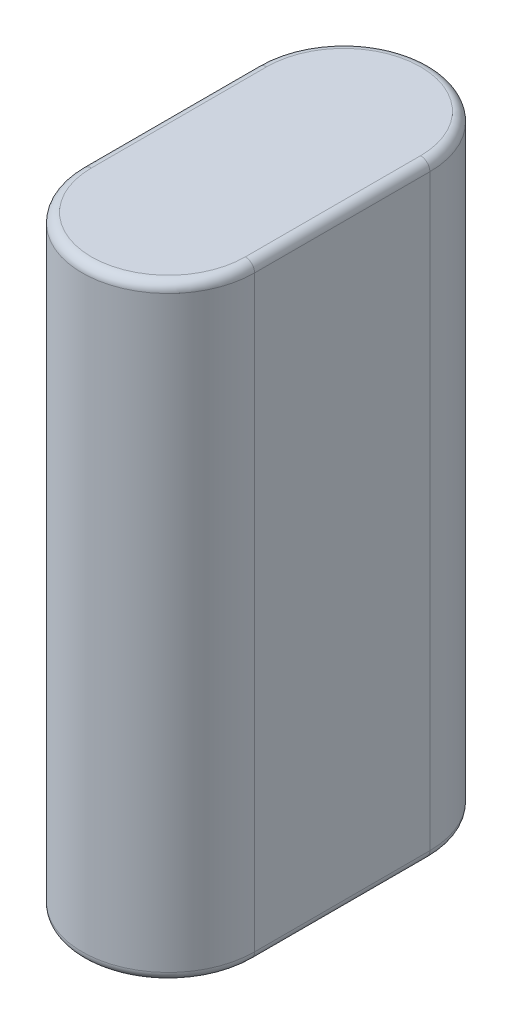
ISO-10303-21;
HEADER;
FILE_DESCRIPTION(('STEP AP214'),'2;1');
FILE_NAME('part.step','',(''),(''),'','','');
FILE_SCHEMA(('AUTOMOTIVE_DESIGN { 1 0 10303 214 1 1 1 1 }'));
ENDSEC;
DATA;
#1=APPLICATION_CONTEXT('core data for automotive mechanical design processes');
#2=APPLICATION_PROTOCOL_DEFINITION('international standard','automotive_design',2000,#1);
#3=PRODUCT_CONTEXT('',#1,'mechanical');
#4=PRODUCT('Part','Part','',(#3));
#5=PRODUCT_RELATED_PRODUCT_CATEGORY('part','',(#4));
#6=PRODUCT_DEFINITION_FORMATION('','',#4);
#7=PRODUCT_DEFINITION_CONTEXT('part definition',#1,'design');
#8=PRODUCT_DEFINITION('design','',#6,#7);
#9=PRODUCT_DEFINITION_SHAPE('','',#8);
#10=(LENGTH_UNIT() NAMED_UNIT(*) SI_UNIT(.MILLI.,.METRE.));
#11=(NAMED_UNIT(*) PLANE_ANGLE_UNIT() SI_UNIT($,.RADIAN.));
#12=(NAMED_UNIT(*) SI_UNIT($,.STERADIAN.) SOLID_ANGLE_UNIT());
#13=UNCERTAINTY_MEASURE_WITH_UNIT(LENGTH_MEASURE(1.E-05),#10,'distance_accuracy_value','');
#14=(GEOMETRIC_REPRESENTATION_CONTEXT(3) GLOBAL_UNCERTAINTY_ASSIGNED_CONTEXT((#13)) GLOBAL_UNIT_ASSIGNED_CONTEXT((#10,
#11,#12)) REPRESENTATION_CONTEXT('',''));
#15=CARTESIAN_POINT('',(0.,0.,0.));
#16=DIRECTION('',(0.,0.,1.));
#17=DIRECTION('',(1.,0.,0.));
#18=AXIS2_PLACEMENT_3D('',#15,#16,#17);
#19=CARTESIAN_POINT('',(0.,65.4,-9.45));
#20=DIRECTION('',(0.,-1.,0.));
#21=DIRECTION('',(0.,0.,-1.));
#22=AXIS2_PLACEMENT_3D('',#19,#20,#21);
#23=CYLINDRICAL_SURFACE('',#22,9.3);
#24=DIRECTION('',(0.,-1.,0.));
#25=VECTOR('',#24,1.);
#26=CARTESIAN_POINT('',(9.3,65.4,-9.45));
#27=LINE('',#26,#25);
#28=CARTESIAN_POINT('',(9.3,64.4,-9.45));
#29=VERTEX_POINT('',#28);
#30=CARTESIAN_POINT('',(9.3,1.,-9.45));
#31=VERTEX_POINT('',#30);
#32=EDGE_CURVE('E115',#29,#31,#27,.T.);
#33=ORIENTED_EDGE('',*,*,#32,.T.);
#34=CARTESIAN_POINT('',(0.,1.,-9.45));
#35=DIRECTION('',(0.,1.,0.));
#36=DIRECTION('',(0.,0.,1.));
#37=AXIS2_PLACEMENT_3D('',#34,#35,#36);
#38=CIRCLE('',#37,9.3);
#39=CARTESIAN_POINT('',(-9.3,1.,-9.45));
#40=VERTEX_POINT('',#39);
#41=EDGE_CURVE('E216',#31,#40,#38,.T.);
#42=ORIENTED_EDGE('',*,*,#41,.T.);
#43=DIRECTION('',(0.,-1.,0.));
#44=VECTOR('',#43,1.);
#45=CARTESIAN_POINT('',(-9.3,65.4,-9.45));
#46=LINE('',#45,#44);
#47=CARTESIAN_POINT('',(-9.3,64.4,-9.45));
#48=VERTEX_POINT('',#47);
#49=EDGE_CURVE('E144',#48,#40,#46,.T.);
#50=ORIENTED_EDGE('',*,*,#49,.F.);
#51=CARTESIAN_POINT('',(0.,64.4,-9.45));
#52=DIRECTION('',(0.,1.,0.));
#53=DIRECTION('',(0.,0.,1.));
#54=AXIS2_PLACEMENT_3D('',#51,#52,#53);
#55=CIRCLE('',#54,9.3);
#56=EDGE_CURVE('E213',#48,#29,#55,.F.);
#57=ORIENTED_EDGE('',*,*,#56,.T.);
#58=EDGE_LOOP('',(#33,#42,#50,#57));
#59=FACE_BOUND('',#58,.T.);
#60=ADVANCED_FACE('F43',(#59),#23,.T.);
#61=CARTESIAN_POINT('',(-9.3,65.4,-9.45));
#62=DIRECTION('',(1.,0.,0.));
#63=DIRECTION('',(0.,0.,-1.));
#64=AXIS2_PLACEMENT_3D('',#61,#62,#63);
#65=PLANE('',#64);
#66=ORIENTED_EDGE('',*,*,#49,.T.);
#67=DIRECTION('',(0.,0.,1.));
#68=VECTOR('',#67,1.);
#69=CARTESIAN_POINT('',(-9.3,1.,-9.45));
#70=LINE('',#69,#68);
#71=CARTESIAN_POINT('',(-9.3,1.,9.45));
#72=VERTEX_POINT('',#71);
#73=EDGE_CURVE('E210',#40,#72,#70,.T.);
#74=ORIENTED_EDGE('',*,*,#73,.T.);
#75=DIRECTION('',(0.,-1.,0.));
#76=VECTOR('',#75,1.);
#77=CARTESIAN_POINT('',(-9.3,65.4,9.45));
#78=LINE('',#77,#76);
#79=CARTESIAN_POINT('',(-9.3,64.4,9.45));
#80=VERTEX_POINT('',#79);
#81=EDGE_CURVE('E134',#80,#72,#78,.T.);
#82=ORIENTED_EDGE('',*,*,#81,.F.);
#83=DIRECTION('',(0.,0.,1.));
#84=VECTOR('',#83,1.);
#85=CARTESIAN_POINT('',(-9.3,64.4,-9.45));
#86=LINE('',#85,#84);
#87=EDGE_CURVE('E207',#80,#48,#86,.F.);
#88=ORIENTED_EDGE('',*,*,#87,.T.);
#89=EDGE_LOOP('',(#66,#74,#82,#88));
#90=FACE_BOUND('',#89,.T.);
#91=ADVANCED_FACE('F232',(#90),#65,.F.);
#92=CARTESIAN_POINT('',(0.,65.4,9.45));
#93=DIRECTION('',(0.,-1.,0.));
#94=DIRECTION('',(0.,0.,-1.));
#95=AXIS2_PLACEMENT_3D('',#92,#93,#94);
#96=CYLINDRICAL_SURFACE('',#95,9.3);
#97=ORIENTED_EDGE('',*,*,#81,.T.);
#98=CARTESIAN_POINT('',(0.,1.,9.45));
#99=DIRECTION('',(0.,1.,0.));
#100=DIRECTION('',(0.,0.,1.));
#101=AXIS2_PLACEMENT_3D('',#98,#99,#100);
#102=CIRCLE('',#101,9.3);
#103=CARTESIAN_POINT('',(9.3,1.,9.45));
#104=VERTEX_POINT('',#103);
#105=EDGE_CURVE('E132',#72,#104,#102,.T.);
#106=ORIENTED_EDGE('',*,*,#105,.T.);
#107=DIRECTION('',(0.,-1.,0.));
#108=VECTOR('',#107,1.);
#109=CARTESIAN_POINT('',(9.3,65.4,9.45));
#110=LINE('',#109,#108);
#111=CARTESIAN_POINT('',(9.3,64.4,9.45));
#112=VERTEX_POINT('',#111);
#113=EDGE_CURVE('E113',#112,#104,#110,.T.);
#114=ORIENTED_EDGE('',*,*,#113,.F.);
#115=CARTESIAN_POINT('',(0.,64.4,9.45));
#116=DIRECTION('',(0.,1.,0.));
#117=DIRECTION('',(0.,0.,1.));
#118=AXIS2_PLACEMENT_3D('',#115,#116,#117);
#119=CIRCLE('',#118,9.3);
#120=EDGE_CURVE('E129',#112,#80,#119,.F.);
#121=ORIENTED_EDGE('',*,*,#120,.T.);
#122=EDGE_LOOP('',(#97,#106,#114,#121));
#123=FACE_BOUND('',#122,.T.);
#124=ADVANCED_FACE('F128',(#123),#96,.T.);
#125=CARTESIAN_POINT('',(9.3,65.4,-9.45));
#126=DIRECTION('',(-1.,0.,0.));
#127=DIRECTION('',(0.,0.,1.));
#128=AXIS2_PLACEMENT_3D('',#125,#126,#127);
#129=PLANE('',#128);
#130=ORIENTED_EDGE('',*,*,#113,.T.);
#131=DIRECTION('',(0.,0.,-1.));
#132=VECTOR('',#131,1.);
#133=CARTESIAN_POINT('',(9.3,1.,-9.45));
#134=LINE('',#133,#132);
#135=EDGE_CURVE('E11',#104,#31,#134,.T.);
#136=ORIENTED_EDGE('',*,*,#135,.T.);
#137=ORIENTED_EDGE('',*,*,#32,.F.);
#138=DIRECTION('',(0.,0.,-1.));
#139=VECTOR('',#138,1.);
#140=CARTESIAN_POINT('',(9.3,64.4,9.45));
#141=LINE('',#140,#139);
#142=EDGE_CURVE('E53',#29,#112,#141,.F.);
#143=ORIENTED_EDGE('',*,*,#142,.T.);
#144=EDGE_LOOP('',(#130,#136,#137,#143));
#145=FACE_BOUND('',#144,.T.);
#146=ADVANCED_FACE('F112',(#145),#129,.F.);
#147=CARTESIAN_POINT('',(0.,65.4,-9.45));
#148=DIRECTION('',(0.,1.,0.));
#149=DIRECTION('',(0.,0.,1.));
#150=AXIS2_PLACEMENT_3D('',#147,#148,#149);
#151=PLANE('',#150);
#152=DIRECTION('',(0.,0.,1.));
#153=VECTOR('',#152,1.);
#154=CARTESIAN_POINT('',(-8.3,65.4,9.45));
#155=LINE('',#154,#153);
#156=CARTESIAN_POINT('',(-8.3,65.4,-9.45));
#157=VERTEX_POINT('',#156);
#158=CARTESIAN_POINT('',(-8.3,65.4,9.45));
#159=VERTEX_POINT('',#158);
#160=EDGE_CURVE('E61',#157,#159,#155,.T.);
#161=ORIENTED_EDGE('',*,*,#160,.T.);
#162=CARTESIAN_POINT('',(0.,65.4,9.45));
#163=DIRECTION('',(0.,1.,0.));
#164=DIRECTION('',(0.,0.,1.));
#165=AXIS2_PLACEMENT_3D('',#162,#163,#164);
#166=CIRCLE('',#165,8.3);
#167=CARTESIAN_POINT('',(8.30000000000001,65.4,9.45));
#168=VERTEX_POINT('',#167);
#169=EDGE_CURVE('E121',#159,#168,#166,.T.);
#170=ORIENTED_EDGE('',*,*,#169,.T.);
#171=DIRECTION('',(0.,0.,-1.));
#172=VECTOR('',#171,1.);
#173=CARTESIAN_POINT('',(8.30000000000001,65.4,-9.45));
#174=LINE('',#173,#172);
#175=CARTESIAN_POINT('',(8.30000000000001,65.4,-9.45));
#176=VERTEX_POINT('',#175);
#177=EDGE_CURVE('E147',#168,#176,#174,.T.);
#178=ORIENTED_EDGE('',*,*,#177,.T.);
#179=CARTESIAN_POINT('',(0.,65.4,-9.45));
#180=DIRECTION('',(0.,1.,0.));
#181=DIRECTION('',(0.,0.,1.));
#182=AXIS2_PLACEMENT_3D('',#179,#180,#181);
#183=CIRCLE('',#182,8.3);
#184=EDGE_CURVE('E66',#176,#157,#183,.T.);
#185=ORIENTED_EDGE('',*,*,#184,.T.);
#186=EDGE_LOOP('',(#161,#170,#178,#185));
#187=FACE_BOUND('',#186,.T.);
#188=ADVANCED_FACE('F226',(#187),#151,.T.);
#189=CARTESIAN_POINT('',(0.,0.,-9.45));
#190=DIRECTION('',(0.,1.,0.));
#191=DIRECTION('',(0.,0.,1.));
#192=AXIS2_PLACEMENT_3D('',#189,#190,#191);
#193=PLANE('',#192);
#194=DIRECTION('',(0.,0.,-1.));
#195=VECTOR('',#194,1.);
#196=CARTESIAN_POINT('',(8.30000000000001,0.,-9.45));
#197=LINE('',#196,#195);
#198=CARTESIAN_POINT('',(8.30000000000001,0.,-9.45));
#199=VERTEX_POINT('',#198);
#200=CARTESIAN_POINT('',(8.30000000000001,0.,9.45));
#201=VERTEX_POINT('',#200);
#202=EDGE_CURVE('E194',#199,#201,#197,.F.);
#203=ORIENTED_EDGE('',*,*,#202,.T.);
#204=CARTESIAN_POINT('',(0.,0.,9.45));
#205=DIRECTION('',(0.,1.,0.));
#206=DIRECTION('',(0.,0.,1.));
#207=AXIS2_PLACEMENT_3D('',#204,#205,#206);
#208=CIRCLE('',#207,8.3);
#209=CARTESIAN_POINT('',(-8.3,0.,9.45));
#210=VERTEX_POINT('',#209);
#211=EDGE_CURVE('E203',#201,#210,#208,.F.);
#212=ORIENTED_EDGE('',*,*,#211,.T.);
#213=DIRECTION('',(0.,0.,1.));
#214=VECTOR('',#213,1.);
#215=CARTESIAN_POINT('',(-8.3,0.,-9.45));
#216=LINE('',#215,#214);
#217=CARTESIAN_POINT('',(-8.3,0.,-9.45));
#218=VERTEX_POINT('',#217);
#219=EDGE_CURVE('E200',#210,#218,#216,.F.);
#220=ORIENTED_EDGE('',*,*,#219,.T.);
#221=CARTESIAN_POINT('',(0.,0.,-9.45));
#222=DIRECTION('',(0.,1.,0.));
#223=DIRECTION('',(0.,0.,1.));
#224=AXIS2_PLACEMENT_3D('',#221,#222,#223);
#225=CIRCLE('',#224,8.3);
#226=EDGE_CURVE('E197',#218,#199,#225,.F.);
#227=ORIENTED_EDGE('',*,*,#226,.T.);
#228=EDGE_LOOP('',(#203,#212,#220,#227));
#229=FACE_BOUND('',#228,.T.);
#230=ADVANCED_FACE('F258',(#229),#193,.F.);
#231=CARTESIAN_POINT('',(0.,1.,-9.45));
#232=DIRECTION('',(0.,1.,0.));
#233=DIRECTION('',(0.,0.,1.));
#234=AXIS2_PLACEMENT_3D('',#231,#232,#233);
#235=TOROIDAL_SURFACE('',#234,8.3,1.);
#236=CARTESIAN_POINT('',(8.30000000000001,1.,-9.45));
#237=DIRECTION('',(0.,0.,1.));
#238=DIRECTION('',(1.,0.,0.));
#239=AXIS2_PLACEMENT_3D('',#236,#237,#238);
#240=CIRCLE('',#239,1.);
#241=EDGE_CURVE('E169',#199,#31,#240,.T.);
#242=ORIENTED_EDGE('',*,*,#241,.F.);
#243=ORIENTED_EDGE('',*,*,#226,.F.);
#244=CARTESIAN_POINT('',(-8.3,1.,-9.45));
#245=DIRECTION('',(0.,0.,1.));
#246=DIRECTION('',(1.,0.,0.));
#247=AXIS2_PLACEMENT_3D('',#244,#245,#246);
#248=CIRCLE('',#247,1.);
#249=EDGE_CURVE('E154',#40,#218,#248,.T.);
#250=ORIENTED_EDGE('',*,*,#249,.F.);
#251=ORIENTED_EDGE('',*,*,#41,.F.);
#252=EDGE_LOOP('',(#242,#243,#250,#251));
#253=FACE_BOUND('',#252,.T.);
#254=ADVANCED_FACE('F234',(#253),#235,.T.);
#255=CARTESIAN_POINT('',(-8.3,1.,-9.45));
#256=DIRECTION('',(0.,0.,1.));
#257=DIRECTION('',(1.,0.,0.));
#258=AXIS2_PLACEMENT_3D('',#255,#256,#257);
#259=CYLINDRICAL_SURFACE('',#258,1.);
#260=ORIENTED_EDGE('',*,*,#249,.T.);
#261=ORIENTED_EDGE('',*,*,#219,.F.);
#262=CARTESIAN_POINT('',(-8.3,1.,9.45));
#263=DIRECTION('',(0.,0.,1.));
#264=DIRECTION('',(1.,0.,0.));
#265=AXIS2_PLACEMENT_3D('',#262,#263,#264);
#266=CIRCLE('',#265,1.);
#267=EDGE_CURVE('E162',#72,#210,#266,.T.);
#268=ORIENTED_EDGE('',*,*,#267,.F.);
#269=ORIENTED_EDGE('',*,*,#73,.F.);
#270=EDGE_LOOP('',(#260,#261,#268,#269));
#271=FACE_BOUND('',#270,.T.);
#272=ADVANCED_FACE('F237',(#271),#259,.T.);
#273=CARTESIAN_POINT('',(8.30000000000001,1.,-9.45));
#274=DIRECTION('',(0.,0.,-1.));
#275=DIRECTION('',(-1.,0.,0.));
#276=AXIS2_PLACEMENT_3D('',#273,#274,#275);
#277=CYLINDRICAL_SURFACE('',#276,1.);
#278=ORIENTED_EDGE('',*,*,#241,.T.);
#279=ORIENTED_EDGE('',*,*,#135,.F.);
#280=CARTESIAN_POINT('',(8.30000000000001,1.,9.45));
#281=DIRECTION('',(0.,0.,1.));
#282=DIRECTION('',(1.,0.,0.));
#283=AXIS2_PLACEMENT_3D('',#280,#281,#282);
#284=CIRCLE('',#283,1.);
#285=EDGE_CURVE('E159',#201,#104,#284,.T.);
#286=ORIENTED_EDGE('',*,*,#285,.F.);
#287=ORIENTED_EDGE('',*,*,#202,.F.);
#288=EDGE_LOOP('',(#278,#279,#286,#287));
#289=FACE_BOUND('',#288,.T.);
#290=ADVANCED_FACE('F240',(#289),#277,.T.);
#291=CARTESIAN_POINT('',(0.,1.,9.45));
#292=DIRECTION('',(0.,1.,0.));
#293=DIRECTION('',(0.,0.,1.));
#294=AXIS2_PLACEMENT_3D('',#291,#292,#293);
#295=TOROIDAL_SURFACE('',#294,8.3,1.);
#296=ORIENTED_EDGE('',*,*,#267,.T.);
#297=ORIENTED_EDGE('',*,*,#211,.F.);
#298=ORIENTED_EDGE('',*,*,#285,.T.);
#299=ORIENTED_EDGE('',*,*,#105,.F.);
#300=EDGE_LOOP('',(#296,#297,#298,#299));
#301=FACE_BOUND('',#300,.T.);
#302=ADVANCED_FACE('F238',(#301),#295,.T.);
#303=CARTESIAN_POINT('',(0.,64.4,-9.45));
#304=DIRECTION('',(0.,1.,0.));
#305=DIRECTION('',(0.,0.,1.));
#306=AXIS2_PLACEMENT_3D('',#303,#304,#305);
#307=TOROIDAL_SURFACE('',#306,8.3,1.);
#308=CARTESIAN_POINT('',(8.30000000000001,64.4,-9.45));
#309=DIRECTION('',(0.,0.,1.));
#310=DIRECTION('',(1.,0.,0.));
#311=AXIS2_PLACEMENT_3D('',#308,#309,#310);
#312=CIRCLE('',#311,1.);
#313=EDGE_CURVE('E151',#29,#176,#312,.T.);
#314=ORIENTED_EDGE('',*,*,#313,.F.);
#315=ORIENTED_EDGE('',*,*,#56,.F.);
#316=CARTESIAN_POINT('',(-8.3,64.4,-9.45));
#317=DIRECTION('',(0.,0.,1.));
#318=DIRECTION('',(1.,0.,0.));
#319=AXIS2_PLACEMENT_3D('',#316,#317,#318);
#320=CIRCLE('',#319,1.);
#321=EDGE_CURVE('E47',#157,#48,#320,.T.);
#322=ORIENTED_EDGE('',*,*,#321,.F.);
#323=ORIENTED_EDGE('',*,*,#184,.F.);
#324=EDGE_LOOP('',(#314,#315,#322,#323));
#325=FACE_BOUND('',#324,.T.);
#326=ADVANCED_FACE('F45',(#325),#307,.T.);
#327=CARTESIAN_POINT('',(-8.3,64.4,-9.45));
#328=DIRECTION('',(0.,0.,-1.));
#329=DIRECTION('',(-1.,0.,0.));
#330=AXIS2_PLACEMENT_3D('',#327,#328,#329);
#331=CYLINDRICAL_SURFACE('',#330,1.);
#332=ORIENTED_EDGE('',*,*,#321,.T.);
#333=ORIENTED_EDGE('',*,*,#87,.F.);
#334=CARTESIAN_POINT('',(-8.3,64.4,9.45));
#335=DIRECTION('',(0.,0.,1.));
#336=DIRECTION('',(1.,0.,0.));
#337=AXIS2_PLACEMENT_3D('',#334,#335,#336);
#338=CIRCLE('',#337,1.);
#339=EDGE_CURVE('E141',#159,#80,#338,.T.);
#340=ORIENTED_EDGE('',*,*,#339,.F.);
#341=ORIENTED_EDGE('',*,*,#160,.F.);
#342=EDGE_LOOP('',(#332,#333,#340,#341));
#343=FACE_BOUND('',#342,.T.);
#344=ADVANCED_FACE('F229',(#343),#331,.T.);
#345=CARTESIAN_POINT('',(8.30000000000001,64.4,-9.45));
#346=DIRECTION('',(0.,0.,1.));
#347=DIRECTION('',(1.,0.,0.));
#348=AXIS2_PLACEMENT_3D('',#345,#346,#347);
#349=CYLINDRICAL_SURFACE('',#348,1.);
#350=ORIENTED_EDGE('',*,*,#313,.T.);
#351=ORIENTED_EDGE('',*,*,#177,.F.);
#352=CARTESIAN_POINT('',(8.30000000000001,64.4,9.45));
#353=DIRECTION('',(0.,0.,1.));
#354=DIRECTION('',(1.,0.,0.));
#355=AXIS2_PLACEMENT_3D('',#352,#353,#354);
#356=CIRCLE('',#355,1.);
#357=EDGE_CURVE('E139',#112,#168,#356,.T.);
#358=ORIENTED_EDGE('',*,*,#357,.F.);
#359=ORIENTED_EDGE('',*,*,#142,.F.);
#360=EDGE_LOOP('',(#350,#351,#358,#359));
#361=FACE_BOUND('',#360,.T.);
#362=ADVANCED_FACE('F146',(#361),#349,.T.);
#363=CARTESIAN_POINT('',(0.,64.4,9.45));
#364=DIRECTION('',(0.,1.,0.));
#365=DIRECTION('',(0.,0.,1.));
#366=AXIS2_PLACEMENT_3D('',#363,#364,#365);
#367=TOROIDAL_SURFACE('',#366,8.3,1.);
#368=ORIENTED_EDGE('',*,*,#339,.T.);
#369=ORIENTED_EDGE('',*,*,#120,.F.);
#370=ORIENTED_EDGE('',*,*,#357,.T.);
#371=ORIENTED_EDGE('',*,*,#169,.F.);
#372=EDGE_LOOP('',(#368,#369,#370,#371));
#373=FACE_BOUND('',#372,.T.);
#374=ADVANCED_FACE('F137',(#373),#367,.T.);
#375=CLOSED_SHELL('',(#60,#91,#124,#146,#188,#230,#254,#272,#290,#302,#326,#344,#362,#374));
#376=MANIFOLD_SOLID_BREP('B2',#375);
#377=ADVANCED_BREP_SHAPE_REPRESENTATION('',(#18,#376),#14);
#378=SHAPE_DEFINITION_REPRESENTATION(#9,#377);
ENDSEC;
END-ISO-10303-21;
